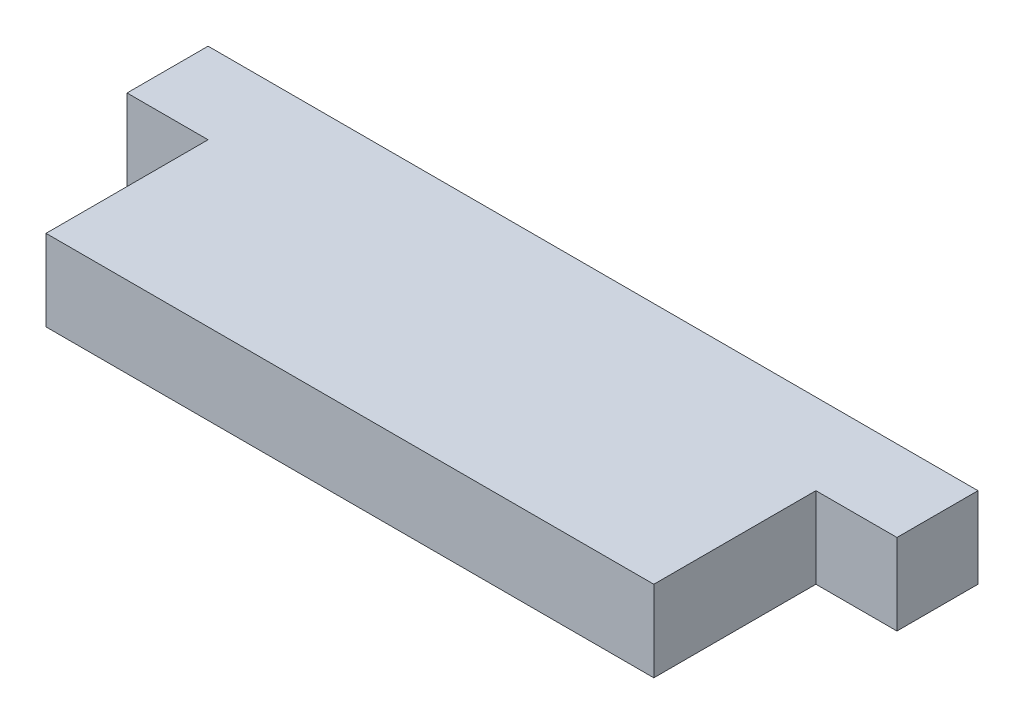
ISO-10303-21;
HEADER;
FILE_DESCRIPTION(('STEP AP214'),'2;1');
FILE_NAME('part.step','',(''),(''),'','','');
FILE_SCHEMA(('AUTOMOTIVE_DESIGN { 1 0 10303 214 1 1 1 1 }'));
ENDSEC;
DATA;
#1=APPLICATION_CONTEXT('core data for automotive mechanical design processes');
#2=APPLICATION_PROTOCOL_DEFINITION('international standard','automotive_design',2000,#1);
#3=PRODUCT_CONTEXT('',#1,'mechanical');
#4=PRODUCT('Part','Part','',(#3));
#5=PRODUCT_RELATED_PRODUCT_CATEGORY('part','',(#4));
#6=PRODUCT_DEFINITION_FORMATION('','',#4);
#7=PRODUCT_DEFINITION_CONTEXT('part definition',#1,'design');
#8=PRODUCT_DEFINITION('design','',#6,#7);
#9=PRODUCT_DEFINITION_SHAPE('','',#8);
#10=(LENGTH_UNIT() NAMED_UNIT(*) SI_UNIT(.MILLI.,.METRE.));
#11=(NAMED_UNIT(*) PLANE_ANGLE_UNIT() SI_UNIT($,.RADIAN.));
#12=(NAMED_UNIT(*) SI_UNIT($,.STERADIAN.) SOLID_ANGLE_UNIT());
#13=UNCERTAINTY_MEASURE_WITH_UNIT(LENGTH_MEASURE(1.E-05),#10,'distance_accuracy_value','');
#14=(GEOMETRIC_REPRESENTATION_CONTEXT(3) GLOBAL_UNCERTAINTY_ASSIGNED_CONTEXT((#13)) GLOBAL_UNIT_ASSIGNED_CONTEXT((#10,
#11,#12)) REPRESENTATION_CONTEXT('',''));
#15=CARTESIAN_POINT('',(0.,0.,0.));
#16=DIRECTION('',(0.,0.,1.));
#17=DIRECTION('',(1.,0.,0.));
#18=AXIS2_PLACEMENT_3D('',#15,#16,#17);
#19=CARTESIAN_POINT('',(-7.5,1.,4.));
#20=DIRECTION('',(1.,0.,0.));
#21=DIRECTION('',(0.,0.,-1.));
#22=AXIS2_PLACEMENT_3D('',#19,#20,#21);
#23=PLANE('',#22);
#24=DIRECTION('',(0.,-1.,0.));
#25=VECTOR('',#24,1.);
#26=CARTESIAN_POINT('',(-7.5,1.,0.));
#27=LINE('',#26,#25);
#28=CARTESIAN_POINT('',(-7.5,1.,0.));
#29=VERTEX_POINT('',#28);
#30=CARTESIAN_POINT('',(-7.5,-1.,0.));
#31=VERTEX_POINT('',#30);
#32=EDGE_CURVE('E120',#29,#31,#27,.T.);
#33=ORIENTED_EDGE('',*,*,#32,.T.);
#34=DIRECTION('',(0.,0.,-1.));
#35=VECTOR('',#34,1.);
#36=CARTESIAN_POINT('',(-7.5,-1.,4.));
#37=LINE('',#36,#35);
#38=CARTESIAN_POINT('',(-7.5,-1.,4.));
#39=VERTEX_POINT('',#38);
#40=EDGE_CURVE('E11',#39,#31,#37,.T.);
#41=ORIENTED_EDGE('',*,*,#40,.F.);
#42=DIRECTION('',(0.,-1.,0.));
#43=VECTOR('',#42,1.);
#44=CARTESIAN_POINT('',(-7.5,1.,4.));
#45=LINE('',#44,#43);
#46=CARTESIAN_POINT('',(-7.5,1.,4.));
#47=VERTEX_POINT('',#46);
#48=EDGE_CURVE('E129',#47,#39,#45,.T.);
#49=ORIENTED_EDGE('',*,*,#48,.F.);
#50=DIRECTION('',(0.,0.,-1.));
#51=VECTOR('',#50,1.);
#52=CARTESIAN_POINT('',(-7.5,1.,4.));
#53=LINE('',#52,#51);
#54=EDGE_CURVE('E135',#47,#29,#53,.T.);
#55=ORIENTED_EDGE('',*,*,#54,.T.);
#56=EDGE_LOOP('',(#33,#41,#49,#55));
#57=FACE_BOUND('',#56,.T.);
#58=ADVANCED_FACE('F34',(#57),#23,.F.);
#59=CARTESIAN_POINT('',(-7.5,-1.,4.));
#60=DIRECTION('',(0.,1.,0.));
#61=DIRECTION('',(0.,0.,1.));
#62=AXIS2_PLACEMENT_3D('',#59,#60,#61);
#63=PLANE('',#62);
#64=ORIENTED_EDGE('',*,*,#40,.T.);
#65=DIRECTION('',(-1.,0.,0.));
#66=VECTOR('',#65,1.);
#67=CARTESIAN_POINT('',(9.5,-1.,0.));
#68=LINE('',#67,#66);
#69=CARTESIAN_POINT('',(-9.5,-1.,0.));
#70=VERTEX_POINT('',#69);
#71=EDGE_CURVE('E152',#31,#70,#68,.T.);
#72=ORIENTED_EDGE('',*,*,#71,.T.);
#73=DIRECTION('',(0.,0.,1.));
#74=VECTOR('',#73,1.);
#75=CARTESIAN_POINT('',(-9.5,-1.,-2.));
#76=LINE('',#75,#74);
#77=CARTESIAN_POINT('',(-9.5,-1.,-2.));
#78=VERTEX_POINT('',#77);
#79=EDGE_CURVE('E102',#78,#70,#76,.T.);
#80=ORIENTED_EDGE('',*,*,#79,.F.);
#81=DIRECTION('',(-1.,0.,0.));
#82=VECTOR('',#81,1.);
#83=CARTESIAN_POINT('',(9.5,-1.,-2.));
#84=LINE('',#83,#82);
#85=CARTESIAN_POINT('',(9.5,-1.,-2.));
#86=VERTEX_POINT('',#85);
#87=EDGE_CURVE('E94',#86,#78,#84,.T.);
#88=ORIENTED_EDGE('',*,*,#87,.F.);
#89=DIRECTION('',(0.,0.,1.));
#90=VECTOR('',#89,1.);
#91=CARTESIAN_POINT('',(9.5,-1.,-2.));
#92=LINE('',#91,#90);
#93=CARTESIAN_POINT('',(9.5,-1.,0.));
#94=VERTEX_POINT('',#93);
#95=EDGE_CURVE('E99',#86,#94,#92,.T.);
#96=ORIENTED_EDGE('',*,*,#95,.T.);
#97=CARTESIAN_POINT('',(7.5,-1.,0.));
#98=VERTEX_POINT('',#97);
#99=EDGE_CURVE('E149',#94,#98,#68,.T.);
#100=ORIENTED_EDGE('',*,*,#99,.T.);
#101=DIRECTION('',(0.,0.,-1.));
#102=VECTOR('',#101,1.);
#103=CARTESIAN_POINT('',(7.5,-1.,4.));
#104=LINE('',#103,#102);
#105=CARTESIAN_POINT('',(7.5,-1.,4.));
#106=VERTEX_POINT('',#105);
#107=EDGE_CURVE('E42',#106,#98,#104,.T.);
#108=ORIENTED_EDGE('',*,*,#107,.F.);
#109=DIRECTION('',(1.,0.,0.));
#110=VECTOR('',#109,1.);
#111=CARTESIAN_POINT('',(-7.5,-1.,4.));
#112=LINE('',#111,#110);
#113=EDGE_CURVE('E131',#39,#106,#112,.T.);
#114=ORIENTED_EDGE('',*,*,#113,.F.);
#115=EDGE_LOOP('',(#64,#72,#80,#88,#96,#100,#108,#114));
#116=FACE_BOUND('',#115,.T.);
#117=ADVANCED_FACE('F96',(#116),#63,.F.);
#118=CARTESIAN_POINT('',(7.5,1.,4.));
#119=DIRECTION('',(-1.,0.,0.));
#120=DIRECTION('',(0.,0.,1.));
#121=AXIS2_PLACEMENT_3D('',#118,#119,#120);
#122=PLANE('',#121);
#123=DIRECTION('',(0.,1.,0.));
#124=VECTOR('',#123,1.);
#125=CARTESIAN_POINT('',(7.5,1.,0.));
#126=LINE('',#125,#124);
#127=CARTESIAN_POINT('',(7.5,1.,0.));
#128=VERTEX_POINT('',#127);
#129=EDGE_CURVE('E123',#98,#128,#126,.T.);
#130=ORIENTED_EDGE('',*,*,#129,.T.);
#131=DIRECTION('',(0.,0.,-1.));
#132=VECTOR('',#131,1.);
#133=CARTESIAN_POINT('',(7.5,1.,4.));
#134=LINE('',#133,#132);
#135=CARTESIAN_POINT('',(7.5,1.,4.));
#136=VERTEX_POINT('',#135);
#137=EDGE_CURVE('E141',#136,#128,#134,.T.);
#138=ORIENTED_EDGE('',*,*,#137,.F.);
#139=DIRECTION('',(0.,1.,0.));
#140=VECTOR('',#139,1.);
#141=CARTESIAN_POINT('',(7.5,1.,4.));
#142=LINE('',#141,#140);
#143=EDGE_CURVE('E133',#106,#136,#142,.T.);
#144=ORIENTED_EDGE('',*,*,#143,.F.);
#145=ORIENTED_EDGE('',*,*,#107,.T.);
#146=EDGE_LOOP('',(#130,#138,#144,#145));
#147=FACE_BOUND('',#146,.T.);
#148=ADVANCED_FACE('F147',(#147),#122,.F.);
#149=CARTESIAN_POINT('',(-7.5,1.,4.));
#150=DIRECTION('',(0.,-1.,0.));
#151=DIRECTION('',(0.,0.,-1.));
#152=AXIS2_PLACEMENT_3D('',#149,#150,#151);
#153=PLANE('',#152);
#154=ORIENTED_EDGE('',*,*,#137,.T.);
#155=DIRECTION('',(1.,0.,0.));
#156=VECTOR('',#155,1.);
#157=CARTESIAN_POINT('',(9.5,1.,0.));
#158=LINE('',#157,#156);
#159=CARTESIAN_POINT('',(9.5,1.,0.));
#160=VERTEX_POINT('',#159);
#161=EDGE_CURVE('E154',#128,#160,#158,.T.);
#162=ORIENTED_EDGE('',*,*,#161,.T.);
#163=DIRECTION('',(0.,0.,1.));
#164=VECTOR('',#163,1.);
#165=CARTESIAN_POINT('',(9.5,1.,-2.));
#166=LINE('',#165,#164);
#167=CARTESIAN_POINT('',(9.5,1.,-2.));
#168=VERTEX_POINT('',#167);
#169=EDGE_CURVE('E161',#168,#160,#166,.T.);
#170=ORIENTED_EDGE('',*,*,#169,.F.);
#171=DIRECTION('',(1.,0.,0.));
#172=VECTOR('',#171,1.);
#173=CARTESIAN_POINT('',(9.5,1.,-2.));
#174=LINE('',#173,#172);
#175=CARTESIAN_POINT('',(-9.5,1.,-2.));
#176=VERTEX_POINT('',#175);
#177=EDGE_CURVE('E111',#176,#168,#174,.T.);
#178=ORIENTED_EDGE('',*,*,#177,.F.);
#179=DIRECTION('',(0.,0.,1.));
#180=VECTOR('',#179,1.);
#181=CARTESIAN_POINT('',(-9.5,1.,-2.));
#182=LINE('',#181,#180);
#183=CARTESIAN_POINT('',(-9.5,1.,0.));
#184=VERTEX_POINT('',#183);
#185=EDGE_CURVE('E125',#176,#184,#182,.T.);
#186=ORIENTED_EDGE('',*,*,#185,.T.);
#187=EDGE_CURVE('E115',#184,#29,#158,.T.);
#188=ORIENTED_EDGE('',*,*,#187,.T.);
#189=ORIENTED_EDGE('',*,*,#54,.F.);
#190=DIRECTION('',(-1.,0.,0.));
#191=VECTOR('',#190,1.);
#192=CARTESIAN_POINT('',(-7.5,1.,4.));
#193=LINE('',#192,#191);
#194=EDGE_CURVE('E49',#136,#47,#193,.T.);
#195=ORIENTED_EDGE('',*,*,#194,.F.);
#196=EDGE_LOOP('',(#154,#162,#170,#178,#186,#188,#189,#195));
#197=FACE_BOUND('',#196,.T.);
#198=ADVANCED_FACE('F166',(#197),#153,.F.);
#199=CARTESIAN_POINT('',(0.,0.,4.));
#200=DIRECTION('',(0.,0.,1.));
#201=DIRECTION('',(1.,0.,0.));
#202=AXIS2_PLACEMENT_3D('',#199,#200,#201);
#203=PLANE('',#202);
#204=ORIENTED_EDGE('',*,*,#48,.T.);
#205=ORIENTED_EDGE('',*,*,#113,.T.);
#206=ORIENTED_EDGE('',*,*,#143,.T.);
#207=ORIENTED_EDGE('',*,*,#194,.T.);
#208=EDGE_LOOP('',(#204,#205,#206,#207));
#209=FACE_BOUND('',#208,.T.);
#210=ADVANCED_FACE('F185',(#209),#203,.T.);
#211=CARTESIAN_POINT('',(0.,0.,0.));
#212=DIRECTION('',(0.,0.,-1.));
#213=DIRECTION('',(-1.,0.,0.));
#214=AXIS2_PLACEMENT_3D('',#211,#212,#213);
#215=PLANE('',#214);
#216=ORIENTED_EDGE('',*,*,#32,.F.);
#217=ORIENTED_EDGE('',*,*,#187,.F.);
#218=DIRECTION('',(0.,1.,0.));
#219=VECTOR('',#218,1.);
#220=CARTESIAN_POINT('',(-9.5,1.,0.));
#221=LINE('',#220,#219);
#222=EDGE_CURVE('E151',#70,#184,#221,.T.);
#223=ORIENTED_EDGE('',*,*,#222,.F.);
#224=ORIENTED_EDGE('',*,*,#71,.F.);
#225=EDGE_LOOP('',(#216,#217,#223,#224));
#226=FACE_BOUND('',#225,.T.);
#227=ADVANCED_FACE('F170',(#226),#215,.F.);
#228=CARTESIAN_POINT('',(9.5,1.,-2.));
#229=DIRECTION('',(-1.,0.,0.));
#230=DIRECTION('',(0.,0.,1.));
#231=AXIS2_PLACEMENT_3D('',#228,#229,#230);
#232=PLANE('',#231);
#233=DIRECTION('',(0.,-1.,0.));
#234=VECTOR('',#233,1.);
#235=CARTESIAN_POINT('',(9.5,1.,0.));
#236=LINE('',#235,#234);
#237=EDGE_CURVE('E119',#160,#94,#236,.T.);
#238=ORIENTED_EDGE('',*,*,#237,.T.);
#239=ORIENTED_EDGE('',*,*,#95,.F.);
#240=DIRECTION('',(0.,-1.,0.));
#241=VECTOR('',#240,1.);
#242=CARTESIAN_POINT('',(9.5,1.,-2.));
#243=LINE('',#242,#241);
#244=EDGE_CURVE('E106',#168,#86,#243,.T.);
#245=ORIENTED_EDGE('',*,*,#244,.F.);
#246=ORIENTED_EDGE('',*,*,#169,.T.);
#247=EDGE_LOOP('',(#238,#239,#245,#246));
#248=FACE_BOUND('',#247,.T.);
#249=ADVANCED_FACE('F117',(#248),#232,.F.);
#250=CARTESIAN_POINT('',(-9.5,1.,-2.));
#251=DIRECTION('',(1.,0.,0.));
#252=DIRECTION('',(0.,0.,-1.));
#253=AXIS2_PLACEMENT_3D('',#250,#251,#252);
#254=PLANE('',#253);
#255=ORIENTED_EDGE('',*,*,#222,.T.);
#256=ORIENTED_EDGE('',*,*,#185,.F.);
#257=DIRECTION('',(0.,1.,0.));
#258=VECTOR('',#257,1.);
#259=CARTESIAN_POINT('',(-9.5,1.,-2.));
#260=LINE('',#259,#258);
#261=EDGE_CURVE('E105',#78,#176,#260,.T.);
#262=ORIENTED_EDGE('',*,*,#261,.F.);
#263=ORIENTED_EDGE('',*,*,#79,.T.);
#264=EDGE_LOOP('',(#255,#256,#262,#263));
#265=FACE_BOUND('',#264,.T.);
#266=ADVANCED_FACE('F181',(#265),#254,.F.);
#267=CARTESIAN_POINT('',(0.,0.,-2.));
#268=DIRECTION('',(0.,0.,-1.));
#269=DIRECTION('',(-1.,0.,0.));
#270=AXIS2_PLACEMENT_3D('',#267,#268,#269);
#271=PLANE('',#270);
#272=ORIENTED_EDGE('',*,*,#244,.T.);
#273=ORIENTED_EDGE('',*,*,#87,.T.);
#274=ORIENTED_EDGE('',*,*,#261,.T.);
#275=ORIENTED_EDGE('',*,*,#177,.T.);
#276=EDGE_LOOP('',(#272,#273,#274,#275));
#277=FACE_BOUND('',#276,.T.);
#278=ADVANCED_FACE('F109',(#277),#271,.T.);
#279=ORIENTED_EDGE('',*,*,#129,.F.);
#280=ORIENTED_EDGE('',*,*,#99,.F.);
#281=ORIENTED_EDGE('',*,*,#237,.F.);
#282=ORIENTED_EDGE('',*,*,#161,.F.);
#283=EDGE_LOOP('',(#279,#280,#281,#282));
#284=FACE_BOUND('',#283,.T.);
#285=ADVANCED_FACE('F175',(#284),#215,.F.);
#286=CLOSED_SHELL('',(#58,#117,#148,#198,#210,#227,#249,#266,#278,#285));
#287=MANIFOLD_SOLID_BREP('B2',#286);
#288=ADVANCED_BREP_SHAPE_REPRESENTATION('',(#18,#287),#14);
#289=SHAPE_DEFINITION_REPRESENTATION(#9,#288);
ENDSEC;
END-ISO-10303-21;
